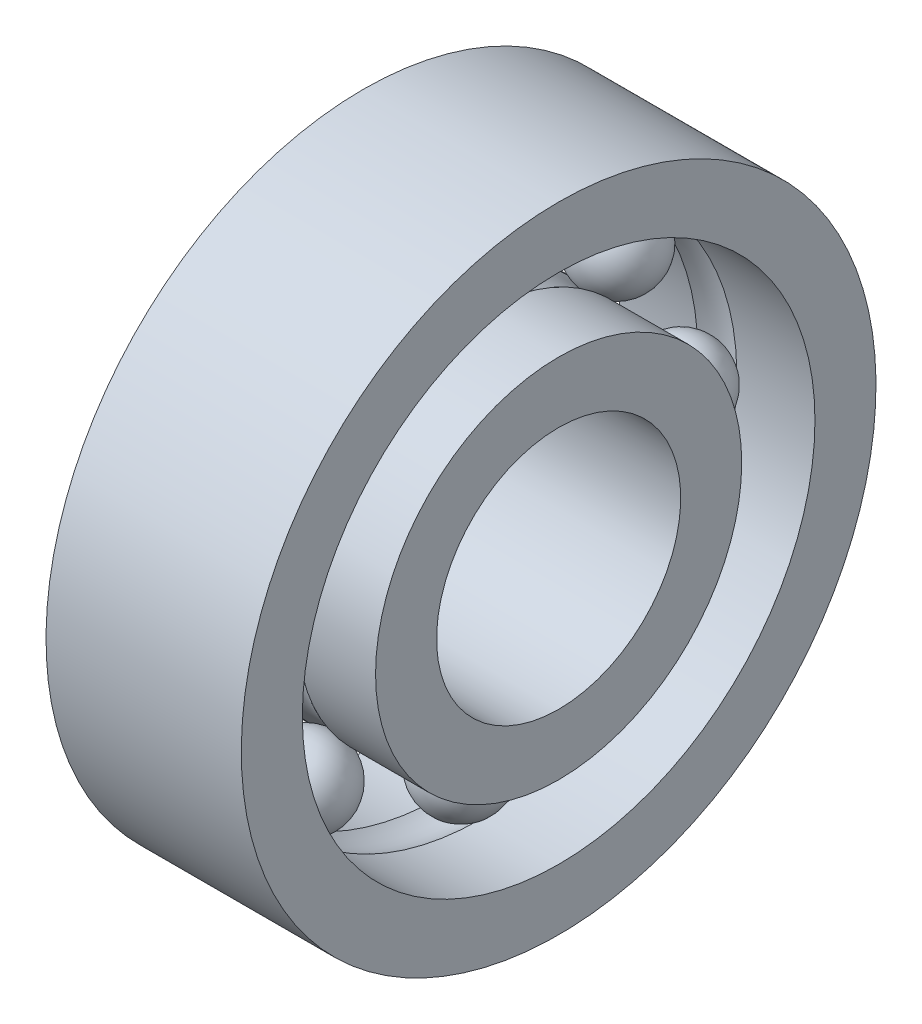
ISO-10303-21;
HEADER;
FILE_DESCRIPTION(('STEP AP214'),'2;1');
FILE_NAME('part.step','',(''),(''),'','','');
FILE_SCHEMA(('AUTOMOTIVE_DESIGN { 1 0 10303 214 1 1 1 1 }'));
ENDSEC;
DATA;
#1=APPLICATION_CONTEXT('core data for automotive mechanical design processes');
#2=APPLICATION_PROTOCOL_DEFINITION('international standard','automotive_design',2000,#1);
#3=PRODUCT_CONTEXT('',#1,'mechanical');
#4=PRODUCT('Part','Part','',(#3));
#5=PRODUCT_RELATED_PRODUCT_CATEGORY('part','',(#4));
#6=PRODUCT_DEFINITION_FORMATION('','',#4);
#7=PRODUCT_DEFINITION_CONTEXT('part definition',#1,'design');
#8=PRODUCT_DEFINITION('design','',#6,#7);
#9=PRODUCT_DEFINITION_SHAPE('','',#8);
#10=(LENGTH_UNIT() NAMED_UNIT(*) SI_UNIT(.MILLI.,.METRE.));
#11=(NAMED_UNIT(*) PLANE_ANGLE_UNIT() SI_UNIT($,.RADIAN.));
#12=(NAMED_UNIT(*) SI_UNIT($,.STERADIAN.) SOLID_ANGLE_UNIT());
#13=UNCERTAINTY_MEASURE_WITH_UNIT(LENGTH_MEASURE(1.E-05),#10,'distance_accuracy_value','');
#14=(GEOMETRIC_REPRESENTATION_CONTEXT(3) GLOBAL_UNCERTAINTY_ASSIGNED_CONTEXT((#13)) GLOBAL_UNIT_ASSIGNED_CONTEXT((#10,
#11,#12)) REPRESENTATION_CONTEXT('',''));
#15=CARTESIAN_POINT('',(0.,0.,0.));
#16=DIRECTION('',(0.,0.,1.));
#17=DIRECTION('',(1.,0.,0.));
#18=AXIS2_PLACEMENT_3D('',#15,#16,#17);
#19=CARTESIAN_POINT('',(2.,3.18198051533949,-3.18198051533944));
#20=DIRECTION('',(0.,0.707106781186554,-0.707106781186541));
#21=DIRECTION('',(-1.,0.,0.));
#22=AXIS2_PLACEMENT_3D('',#19,#20,#21);
#23=SPHERICAL_SURFACE('',#22,0.85);
#24=CARTESIAN_POINT('',(2.,2.58093975133092,-2.58093975133088));
#25=VERTEX_POINT('',#24);
#26=VERTEX_LOOP('',#25);
#27=FACE_BOUND('',#26,.T.);
#28=ADVANCED_FACE('P0_F13',(#27),#23,.T.);
#29=CLOSED_SHELL('',(#28));
#30=MANIFOLD_SOLID_BREP('P0_B1',#29);
#31=CARTESIAN_POINT('',(2.,0.,0.));
#32=DIRECTION('',(-1.,0.,0.));
#33=DIRECTION('',(0.,-1.,0.));
#34=AXIS2_PLACEMENT_3D('',#31,#32,#33);
#35=TOROIDAL_SURFACE('',#34,4.5,0.85);
#36=CARTESIAN_POINT('',(1.6,0.,0.));
#37=DIRECTION('',(1.,0.,0.));
#38=DIRECTION('',(0.,1.,0.));
#39=AXIS2_PLACEMENT_3D('',#36,#37,#38);
#40=CIRCLE('',#39,3.75);
#41=CARTESIAN_POINT('',(1.6,3.75,0.));
#42=VERTEX_POINT('',#41);
#43=EDGE_CURVE('P1_E61',#42,#42,#40,.T.);
#44=ORIENTED_EDGE('',*,*,#43,.T.);
#45=EDGE_LOOP('',(#44));
#46=FACE_BOUND('',#45,.T.);
#47=CARTESIAN_POINT('',(2.4,0.,0.));
#48=DIRECTION('',(-1.,0.,0.));
#49=DIRECTION('',(0.,-1.,0.));
#50=AXIS2_PLACEMENT_3D('',#47,#48,#49);
#51=CIRCLE('',#50,3.75);
#52=CARTESIAN_POINT('',(2.4,-3.75,0.));
#53=VERTEX_POINT('',#52);
#54=EDGE_CURVE('P1_E72',#53,#53,#51,.T.);
#55=ORIENTED_EDGE('',*,*,#54,.T.);
#56=EDGE_LOOP('',(#55));
#57=FACE_BOUND('',#56,.T.);
#58=ADVANCED_FACE('P1_F16',(#46,#57),#35,.F.);
#59=CARTESIAN_POINT('',(0.,0.,0.));
#60=DIRECTION('',(1.,0.,0.));
#61=DIRECTION('',(0.,1.,0.));
#62=AXIS2_PLACEMENT_3D('',#59,#60,#61);
#63=PLANE('',#62);
#64=CARTESIAN_POINT('',(0.,0.,0.));
#65=DIRECTION('',(1.,0.,0.));
#66=DIRECTION('',(0.,1.,0.));
#67=AXIS2_PLACEMENT_3D('',#64,#65,#66);
#68=CIRCLE('',#67,3.75);
#69=CARTESIAN_POINT('',(0.,3.75,0.));
#70=VERTEX_POINT('',#69);
#71=EDGE_CURVE('P1_E57',#70,#70,#68,.T.);
#72=ORIENTED_EDGE('',*,*,#71,.F.);
#73=EDGE_LOOP('',(#72));
#74=FACE_BOUND('',#73,.T.);
#75=CARTESIAN_POINT('',(0.,0.,0.));
#76=DIRECTION('',(1.,0.,0.));
#77=DIRECTION('',(0.,1.,0.));
#78=AXIS2_PLACEMENT_3D('',#75,#76,#77);
#79=CIRCLE('',#78,2.5);
#80=CARTESIAN_POINT('',(0.,2.5,0.));
#81=VERTEX_POINT('',#80);
#82=EDGE_CURVE('P1_E11',#81,#81,#79,.T.);
#83=ORIENTED_EDGE('',*,*,#82,.T.);
#84=EDGE_LOOP('',(#83));
#85=FACE_BOUND('',#84,.T.);
#86=ADVANCED_FACE('P1_F99',(#74,#85),#63,.F.);
#87=CARTESIAN_POINT('',(4.,0.,0.));
#88=DIRECTION('',(1.,0.,0.));
#89=DIRECTION('',(0.,1.,0.));
#90=AXIS2_PLACEMENT_3D('',#87,#88,#89);
#91=PLANE('',#90);
#92=CARTESIAN_POINT('',(4.,0.,0.));
#93=DIRECTION('',(1.,0.,0.));
#94=DIRECTION('',(0.,1.,0.));
#95=AXIS2_PLACEMENT_3D('',#92,#93,#94);
#96=CIRCLE('',#95,3.75);
#97=CARTESIAN_POINT('',(4.,3.75,0.));
#98=VERTEX_POINT('',#97);
#99=EDGE_CURVE('P1_E67',#98,#98,#96,.T.);
#100=ORIENTED_EDGE('',*,*,#99,.T.);
#101=EDGE_LOOP('',(#100));
#102=FACE_BOUND('',#101,.T.);
#103=CARTESIAN_POINT('',(4.,0.,0.));
#104=DIRECTION('',(1.,0.,0.));
#105=DIRECTION('',(0.,1.,0.));
#106=AXIS2_PLACEMENT_3D('',#103,#104,#105);
#107=CIRCLE('',#106,2.5);
#108=CARTESIAN_POINT('',(4.,2.5,0.));
#109=VERTEX_POINT('',#108);
#110=EDGE_CURVE('P1_E24',#109,#109,#107,.T.);
#111=ORIENTED_EDGE('',*,*,#110,.F.);
#112=EDGE_LOOP('',(#111));
#113=FACE_BOUND('',#112,.T.);
#114=ADVANCED_FACE('P1_F107',(#102,#113),#91,.T.);
#115=CARTESIAN_POINT('',(4.,0.,0.));
#116=DIRECTION('',(-1.,0.,0.));
#117=DIRECTION('',(0.,-1.,0.));
#118=AXIS2_PLACEMENT_3D('',#115,#116,#117);
#119=CYLINDRICAL_SURFACE('',#118,2.5);
#120=ORIENTED_EDGE('',*,*,#82,.F.);
#121=EDGE_LOOP('',(#120));
#122=FACE_BOUND('',#121,.T.);
#123=ORIENTED_EDGE('',*,*,#110,.T.);
#124=EDGE_LOOP('',(#123));
#125=FACE_BOUND('',#124,.T.);
#126=ADVANCED_FACE('P1_F114',(#122,#125),#119,.F.);
#127=CARTESIAN_POINT('',(4.,0.,0.));
#128=DIRECTION('',(-1.,0.,0.));
#129=DIRECTION('',(0.,-1.,0.));
#130=AXIS2_PLACEMENT_3D('',#127,#128,#129);
#131=CYLINDRICAL_SURFACE('',#130,3.75);
#132=ORIENTED_EDGE('',*,*,#54,.F.);
#133=EDGE_LOOP('',(#132));
#134=FACE_BOUND('',#133,.T.);
#135=ORIENTED_EDGE('',*,*,#99,.F.);
#136=EDGE_LOOP('',(#135));
#137=FACE_BOUND('',#136,.T.);
#138=ADVANCED_FACE('P1_F120',(#134,#137),#131,.T.);
#139=CARTESIAN_POINT('',(4.,0.,0.));
#140=DIRECTION('',(-1.,0.,0.));
#141=DIRECTION('',(0.,-1.,0.));
#142=AXIS2_PLACEMENT_3D('',#139,#140,#141);
#143=CYLINDRICAL_SURFACE('',#142,3.75);
#144=ORIENTED_EDGE('',*,*,#43,.F.);
#145=EDGE_LOOP('',(#144));
#146=FACE_BOUND('',#145,.T.);
#147=ORIENTED_EDGE('',*,*,#71,.T.);
#148=EDGE_LOOP('',(#147));
#149=FACE_BOUND('',#148,.T.);
#150=ADVANCED_FACE('P1_F58',(#146,#149),#143,.T.);
#151=CLOSED_SHELL('',(#58,#86,#114,#126,#138,#150));
#152=MANIFOLD_SOLID_BREP('P1_B1',#151);
#153=CARTESIAN_POINT('',(2.,0.,-4.5));
#154=DIRECTION('',(0.,0.,-1.));
#155=DIRECTION('',(-1.,0.,0.));
#156=AXIS2_PLACEMENT_3D('',#153,#154,#155);
#157=SPHERICAL_SURFACE('',#156,0.85);
#158=CARTESIAN_POINT('',(2.,0.,-3.65));
#159=VERTEX_POINT('',#158);
#160=VERTEX_LOOP('',#159);
#161=FACE_BOUND('',#160,.T.);
#162=ADVANCED_FACE('P2_F14',(#161),#157,.T.);
#163=CLOSED_SHELL('',(#162));
#164=MANIFOLD_SOLID_BREP('P2_B1',#163);
#165=CARTESIAN_POINT('',(2.,-3.18198051533947,3.18198051533946));
#166=DIRECTION('',(0.,-0.707106781186549,0.707106781186546));
#167=DIRECTION('',(-1.,0.,0.));
#168=AXIS2_PLACEMENT_3D('',#165,#166,#167);
#169=SPHERICAL_SURFACE('',#168,0.85);
#170=CARTESIAN_POINT('',(2.,-2.5809397513309,2.5809397513309));
#171=VERTEX_POINT('',#170);
#172=VERTEX_LOOP('',#171);
#173=FACE_BOUND('',#172,.T.);
#174=ADVANCED_FACE('P3_F14',(#173),#169,.T.);
#175=CLOSED_SHELL('',(#174));
#176=MANIFOLD_SOLID_BREP('P3_B1',#175);
#177=CARTESIAN_POINT('',(2.,3.18198051533943,3.1819805153395));
#178=DIRECTION('',(0.,0.707106781186539,0.707106781186556));
#179=DIRECTION('',(-1.,0.,0.));
#180=AXIS2_PLACEMENT_3D('',#177,#178,#179);
#181=SPHERICAL_SURFACE('',#180,0.85);
#182=CARTESIAN_POINT('',(2.,2.58093975133087,2.58093975133093));
#183=VERTEX_POINT('',#182);
#184=VERTEX_LOOP('',#183);
#185=FACE_BOUND('',#184,.T.);
#186=ADVANCED_FACE('P4_F14',(#185),#181,.T.);
#187=CLOSED_SHELL('',(#186));
#188=MANIFOLD_SOLID_BREP('P4_B1',#187);
#189=CARTESIAN_POINT('',(2.,-3.18198051533945,-3.18198051533948));
#190=DIRECTION('',(0.,-0.707106781186544,-0.707106781186551));
#191=DIRECTION('',(-1.,0.,0.));
#192=AXIS2_PLACEMENT_3D('',#189,#190,#191);
#193=SPHERICAL_SURFACE('',#192,0.85);
#194=CARTESIAN_POINT('',(2.,-2.58093975133089,-2.58093975133091));
#195=VERTEX_POINT('',#194);
#196=VERTEX_LOOP('',#195);
#197=FACE_BOUND('',#196,.T.);
#198=ADVANCED_FACE('P5_F14',(#197),#193,.T.);
#199=CLOSED_SHELL('',(#198));
#200=MANIFOLD_SOLID_BREP('P5_B1',#199);
#201=CARTESIAN_POINT('',(2.,0.,4.5));
#202=DIRECTION('',(0.,0.,1.));
#203=DIRECTION('',(-1.,0.,0.));
#204=AXIS2_PLACEMENT_3D('',#201,#202,#203);
#205=SPHERICAL_SURFACE('',#204,0.85);
#206=CARTESIAN_POINT('',(2.,0.,3.65));
#207=VERTEX_POINT('',#206);
#208=VERTEX_LOOP('',#207);
#209=FACE_BOUND('',#208,.T.);
#210=ADVANCED_FACE('P6_F14',(#209),#205,.T.);
#211=CLOSED_SHELL('',(#210));
#212=MANIFOLD_SOLID_BREP('P6_B1',#211);
#213=CARTESIAN_POINT('',(2.,4.5,0.));
#214=DIRECTION('',(0.,1.,0.));
#215=DIRECTION('',(-1.,0.,0.));
#216=AXIS2_PLACEMENT_3D('',#213,#214,#215);
#217=SPHERICAL_SURFACE('',#216,0.85);
#218=CARTESIAN_POINT('',(2.,3.65,0.));
#219=VERTEX_POINT('',#218);
#220=VERTEX_LOOP('',#219);
#221=FACE_BOUND('',#220,.T.);
#222=ADVANCED_FACE('P7_F14',(#221),#217,.T.);
#223=CLOSED_SHELL('',(#222));
#224=MANIFOLD_SOLID_BREP('P7_B1',#223);
#225=CARTESIAN_POINT('',(2.,-4.5,0.));
#226=DIRECTION('',(0.,-1.,0.));
#227=DIRECTION('',(-1.,0.,0.));
#228=AXIS2_PLACEMENT_3D('',#225,#226,#227);
#229=SPHERICAL_SURFACE('',#228,0.85);
#230=CARTESIAN_POINT('',(2.,-3.65,0.));
#231=VERTEX_POINT('',#230);
#232=VERTEX_LOOP('',#231);
#233=FACE_BOUND('',#232,.T.);
#234=ADVANCED_FACE('P8_F14',(#233),#229,.T.);
#235=CLOSED_SHELL('',(#234));
#236=MANIFOLD_SOLID_BREP('P8_B1',#235);
#237=CARTESIAN_POINT('',(2.,0.,0.));
#238=DIRECTION('',(-1.,0.,0.));
#239=DIRECTION('',(0.,-1.,0.));
#240=AXIS2_PLACEMENT_3D('',#237,#238,#239);
#241=TOROIDAL_SURFACE('',#240,4.5,0.85);
#242=CARTESIAN_POINT('',(2.4,0.,0.));
#243=DIRECTION('',(-1.,0.,0.));
#244=DIRECTION('',(0.,-1.,0.));
#245=AXIS2_PLACEMENT_3D('',#242,#243,#244);
#246=CIRCLE('',#245,5.25);
#247=CARTESIAN_POINT('',(2.4,-5.25,0.));
#248=VERTEX_POINT('',#247);
#249=EDGE_CURVE('P9_E70',#248,#248,#246,.T.);
#250=ORIENTED_EDGE('',*,*,#249,.F.);
#251=EDGE_LOOP('',(#250));
#252=FACE_BOUND('',#251,.T.);
#253=CARTESIAN_POINT('',(1.6,0.,0.));
#254=DIRECTION('',(1.,0.,0.));
#255=DIRECTION('',(0.,1.,0.));
#256=AXIS2_PLACEMENT_3D('',#253,#254,#255);
#257=CIRCLE('',#256,5.25);
#258=CARTESIAN_POINT('',(1.6,5.25,0.));
#259=VERTEX_POINT('',#258);
#260=EDGE_CURVE('P9_E60',#259,#259,#257,.T.);
#261=ORIENTED_EDGE('',*,*,#260,.F.);
#262=EDGE_LOOP('',(#261));
#263=FACE_BOUND('',#262,.T.);
#264=ADVANCED_FACE('P9_F15',(#252,#263),#241,.F.);
#265=CARTESIAN_POINT('',(0.,0.,0.));
#266=DIRECTION('',(1.,0.,0.));
#267=DIRECTION('',(0.,1.,0.));
#268=AXIS2_PLACEMENT_3D('',#265,#266,#267);
#269=PLANE('',#268);
#270=CARTESIAN_POINT('',(0.,0.,0.));
#271=DIRECTION('',(1.,0.,0.));
#272=DIRECTION('',(0.,1.,0.));
#273=AXIS2_PLACEMENT_3D('',#270,#271,#272);
#274=CIRCLE('',#273,6.5);
#275=CARTESIAN_POINT('',(0.,6.5,0.));
#276=VERTEX_POINT('',#275);
#277=EDGE_CURVE('P9_E10',#276,#276,#274,.T.);
#278=ORIENTED_EDGE('',*,*,#277,.F.);
#279=EDGE_LOOP('',(#278));
#280=FACE_BOUND('',#279,.T.);
#281=CARTESIAN_POINT('',(0.,0.,0.));
#282=DIRECTION('',(1.,0.,0.));
#283=DIRECTION('',(0.,1.,0.));
#284=AXIS2_PLACEMENT_3D('',#281,#282,#283);
#285=CIRCLE('',#284,5.25);
#286=CARTESIAN_POINT('',(0.,5.25,0.));
#287=VERTEX_POINT('',#286);
#288=EDGE_CURVE('P9_E56',#287,#287,#285,.T.);
#289=ORIENTED_EDGE('',*,*,#288,.T.);
#290=EDGE_LOOP('',(#289));
#291=FACE_BOUND('',#290,.T.);
#292=ADVANCED_FACE('P9_F57',(#280,#291),#269,.F.);
#293=CARTESIAN_POINT('',(4.,0.,0.));
#294=DIRECTION('',(1.,0.,0.));
#295=DIRECTION('',(0.,1.,0.));
#296=AXIS2_PLACEMENT_3D('',#293,#294,#295);
#297=PLANE('',#296);
#298=CARTESIAN_POINT('',(4.,0.,0.));
#299=DIRECTION('',(1.,0.,0.));
#300=DIRECTION('',(0.,1.,0.));
#301=AXIS2_PLACEMENT_3D('',#298,#299,#300);
#302=CIRCLE('',#301,6.5);
#303=CARTESIAN_POINT('',(4.,6.5,0.));
#304=VERTEX_POINT('',#303);
#305=EDGE_CURVE('P9_E23',#304,#304,#302,.T.);
#306=ORIENTED_EDGE('',*,*,#305,.T.);
#307=EDGE_LOOP('',(#306));
#308=FACE_BOUND('',#307,.T.);
#309=CARTESIAN_POINT('',(4.,0.,0.));
#310=DIRECTION('',(1.,0.,0.));
#311=DIRECTION('',(0.,1.,0.));
#312=AXIS2_PLACEMENT_3D('',#309,#310,#311);
#313=CIRCLE('',#312,5.25);
#314=CARTESIAN_POINT('',(4.,5.25,0.));
#315=VERTEX_POINT('',#314);
#316=EDGE_CURVE('P9_E65',#315,#315,#313,.T.);
#317=ORIENTED_EDGE('',*,*,#316,.F.);
#318=EDGE_LOOP('',(#317));
#319=FACE_BOUND('',#318,.T.);
#320=ADVANCED_FACE('P9_F104',(#308,#319),#297,.T.);
#321=CARTESIAN_POINT('',(4.,0.,0.));
#322=DIRECTION('',(-1.,0.,0.));
#323=DIRECTION('',(0.,-1.,0.));
#324=AXIS2_PLACEMENT_3D('',#321,#322,#323);
#325=CYLINDRICAL_SURFACE('',#324,6.5);
#326=ORIENTED_EDGE('',*,*,#277,.T.);
#327=EDGE_LOOP('',(#326));
#328=FACE_BOUND('',#327,.T.);
#329=ORIENTED_EDGE('',*,*,#305,.F.);
#330=EDGE_LOOP('',(#329));
#331=FACE_BOUND('',#330,.T.);
#332=ADVANCED_FACE('P9_F110',(#328,#331),#325,.T.);
#333=CARTESIAN_POINT('',(4.,0.,0.));
#334=DIRECTION('',(-1.,0.,0.));
#335=DIRECTION('',(0.,-1.,0.));
#336=AXIS2_PLACEMENT_3D('',#333,#334,#335);
#337=CYLINDRICAL_SURFACE('',#336,5.25);
#338=ORIENTED_EDGE('',*,*,#249,.T.);
#339=EDGE_LOOP('',(#338));
#340=FACE_BOUND('',#339,.T.);
#341=ORIENTED_EDGE('',*,*,#316,.T.);
#342=EDGE_LOOP('',(#341));
#343=FACE_BOUND('',#342,.T.);
#344=ADVANCED_FACE('P9_F124',(#340,#343),#337,.F.);
#345=CARTESIAN_POINT('',(4.,0.,0.));
#346=DIRECTION('',(-1.,0.,0.));
#347=DIRECTION('',(0.,-1.,0.));
#348=AXIS2_PLACEMENT_3D('',#345,#346,#347);
#349=CYLINDRICAL_SURFACE('',#348,5.25);
#350=ORIENTED_EDGE('',*,*,#260,.T.);
#351=EDGE_LOOP('',(#350));
#352=FACE_BOUND('',#351,.T.);
#353=ORIENTED_EDGE('',*,*,#288,.F.);
#354=EDGE_LOOP('',(#353));
#355=FACE_BOUND('',#354,.T.);
#356=ADVANCED_FACE('P9_F119',(#352,#355),#349,.F.);
#357=CLOSED_SHELL('',(#264,#292,#320,#332,#344,#356));
#358=MANIFOLD_SOLID_BREP('P9_B1',#357);
#359=ADVANCED_BREP_SHAPE_REPRESENTATION('',(#18,#30,#152,#164,#176,#188,#200,#212,#224,#236,
#358),#14);
#360=SHAPE_DEFINITION_REPRESENTATION(#9,#359);
ENDSEC;
END-ISO-10303-21;
